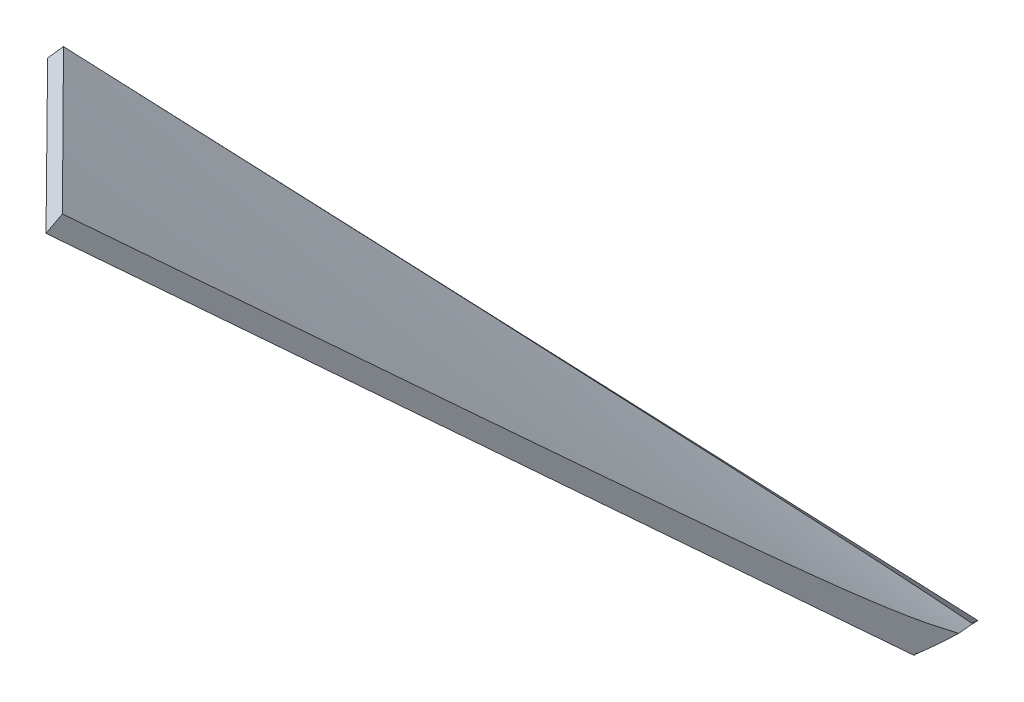
ISO-10303-21;
HEADER;
FILE_DESCRIPTION(('STEP AP214'),'2;1');
FILE_NAME('part.step','',(''),(''),'','','');
FILE_SCHEMA(('AUTOMOTIVE_DESIGN { 1 0 10303 214 1 1 1 1 }'));
ENDSEC;
DATA;
#1=APPLICATION_CONTEXT('core data for automotive mechanical design processes');
#2=APPLICATION_PROTOCOL_DEFINITION('international standard','automotive_design',2000,#1);
#3=PRODUCT_CONTEXT('',#1,'mechanical');
#4=PRODUCT('Part','Part','',(#3));
#5=PRODUCT_RELATED_PRODUCT_CATEGORY('part','',(#4));
#6=PRODUCT_DEFINITION_FORMATION('','',#4);
#7=PRODUCT_DEFINITION_CONTEXT('part definition',#1,'design');
#8=PRODUCT_DEFINITION('design','',#6,#7);
#9=PRODUCT_DEFINITION_SHAPE('','',#8);
#10=(LENGTH_UNIT() NAMED_UNIT(*) SI_UNIT(.MILLI.,.METRE.));
#11=(NAMED_UNIT(*) PLANE_ANGLE_UNIT() SI_UNIT($,.RADIAN.));
#12=(NAMED_UNIT(*) SI_UNIT($,.STERADIAN.) SOLID_ANGLE_UNIT());
#13=UNCERTAINTY_MEASURE_WITH_UNIT(LENGTH_MEASURE(1.E-05),#10,'distance_accuracy_value','');
#14=(GEOMETRIC_REPRESENTATION_CONTEXT(3) GLOBAL_UNCERTAINTY_ASSIGNED_CONTEXT((#13)) GLOBAL_UNIT_ASSIGNED_CONTEXT((#10,
#11,#12)) REPRESENTATION_CONTEXT('',''));
#15=CARTESIAN_POINT('',(0.,0.,0.));
#16=DIRECTION('',(0.,0.,1.));
#17=DIRECTION('',(1.,0.,0.));
#18=AXIS2_PLACEMENT_3D('',#15,#16,#17);
#19=CARTESIAN_POINT('',(125.373540665109,304.904026269313,170.043614927809));
#20=DIRECTION('',(-0.573127406974546,0.259388760360703,-0.777330332852881));
#21=DIRECTION('',(-0.804878930909392,0.,0.593439050432438));
#22=AXIS2_PLACEMENT_3D('',#19,#20,#21);
#23=PLANE('',#22);
#24=CARTESIAN_POINT('',(-299.633713521394,361.646186737307,502.336811715639));
#25=CARTESIAN_POINT('',(-288.248889195906,347.466194704429,489.211010385189));
#26=CARTESIAN_POINT('',(-276.864233903127,333.286011837559,476.085268574526));
#27=CARTESIAN_POINT('',(-254.095497893526,304.924997070927,449.833990752767));
#28=CARTESIAN_POINT('',(-242.711417176659,290.744165171215,436.708454741655));
#29=CARTESIAN_POINT('',(-219.944065032452,262.381582736006,410.457673207292));
#30=CARTESIAN_POINT('',(-208.560793605115,248.199832200505,397.332427684041));
#31=CARTESIAN_POINT('',(-185.795493728506,219.834918850772,371.082381729464));
#32=CARTESIAN_POINT('',(-174.413465279328,205.651756036432,357.957581298172));
#33=CARTESIAN_POINT('',(-157.688399182237,184.806968620088,338.670417652192));
#34=CARTESIAN_POINT('',(-152.344546570563,178.146268476332,332.507762034174));
#35=CARTESIAN_POINT('',(-141.657457027641,164.82417009002,320.182671788908));
#36=CARTESIAN_POINT('',(-136.314220096383,158.162771847475,314.020237161657));
#37=CARTESIAN_POINT('',(-125.628576335731,144.83903650065,301.695666653188));
#38=CARTESIAN_POINT('',(-120.286169506174,138.176699396552,295.53353077191));
#39=CARTESIAN_POINT('',(-109.60250990655,124.850716003804,283.209673035723));
#40=CARTESIAN_POINT('',(-104.261257136551,118.187069715076,277.047951180838));
#41=CARTESIAN_POINT('',(-95.360573497638,107.079388881455,266.77891502101));
#42=CARTESIAN_POINT('',(-91.8006728282525,102.635886778409,262.671432002588));
#43=CARTESIAN_POINT('',(-84.6818718118825,93.7477496316358,254.456825452681));
#44=CARTESIAN_POINT('',(-81.1229714648473,89.303114587967,250.349701921178));
#45=CARTESIAN_POINT('',(-74.006534177173,80.4123017764682,242.135945306376));
#46=CARTESIAN_POINT('',(-70.4489972363188,75.9661240088816,238.029312223));
#47=CARTESIAN_POINT('',(-63.335838701481,67.0715947820844,229.816732902737));
#48=CARTESIAN_POINT('',(-59.780217108774,62.6232433214286,225.710786666308));
#49=CARTESIAN_POINT('',(-54.4489268178406,55.9482932535577,219.552638191287));
#50=CARTESIAN_POINT('',(-52.6721869552184,53.7229059401655,217.50005037959));
#51=CARTESIAN_POINT('',(-49.1196057492542,49.2711160241236,213.395198442784));
#52=CARTESIAN_POINT('',(-47.3437644058719,47.0447134215193,211.34293431766));
#53=CARTESIAN_POINT('',(-43.7932061572879,42.5906349607742,207.238810243283));
#54=CARTESIAN_POINT('',(-42.0184892529597,40.3629591016468,205.186950294345));
#55=CARTESIAN_POINT('',(-38.4705406940791,35.9059311246791,201.083766120683));
#56=CARTESIAN_POINT('',(-36.6973090397554,33.6765790065807,199.032441896043));
#57=CARTESIAN_POINT('',(-34.9249999999667,31.4461867373069,196.981450827258));
#58=B_SPLINE_CURVE_WITH_KNOTS('',3,(#24,#25,#26,#27,#28,#29,#30,#31,#32,#33,#34,#35,#36,#37,#38,
#39,#40,#41,#42,#43,#44,#45,#46,#47,#48,#49,#50,#51,#52,#53,#54,#55,#56,#57),.UNSPECIFIED.,.F.,
.F.,(4,2,2,2,2,2,2,2,2,2,2,2,2,2,2,2,4),(0.,67.2811826532365,134.562360121039,201.843537837132,
269.12472068614,300.717442961109,332.310164719119,363.902880325644,395.49559779708,
416.557439577105,437.619280291128,458.68111768292,479.742969096637,490.273896171492,
500.804822775967,511.33575755134,521.866693948089),.UNSPECIFIED.);
#59=CARTESIAN_POINT('',(-299.633713521394,361.646186737307,502.336811715639));
#60=VERTEX_POINT('',#59);
#61=CARTESIAN_POINT('',(-34.9249999999667,31.4461867373068,196.981450827258));
#62=VERTEX_POINT('',#61);
#63=EDGE_CURVE('E83',#60,#62,#58,.T.);
#64=ORIENTED_EDGE('',*,*,#63,.F.);
#65=CARTESIAN_POINT('',(-292.263898452872,370.241239300258,499.771132815892));
#66=CARTESIAN_POINT('',(-292.571129353185,369.883291165472,499.878189883072));
#67=CARTESIAN_POINT('',(-292.878340832318,369.525320613587,499.985227732709));
#68=CARTESIAN_POINT('',(-293.492724942232,368.809334709742,500.199264999423));
#69=CARTESIAN_POINT('',(-293.799897573014,368.451319357782,500.306264416503));
#70=CARTESIAN_POINT('',(-294.414203993436,367.735243872532,500.520224825237));
#71=CARTESIAN_POINT('',(-294.721337783076,367.377183739242,500.627185816892));
#72=CARTESIAN_POINT('',(-295.335566528425,366.661018710065,500.841069381911));
#73=CARTESIAN_POINT('',(-295.642661484134,366.302913814179,500.947991955275));
#74=CARTESIAN_POINT('',(-296.256812568831,365.586659278535,501.161798690845));
#75=CARTESIAN_POINT('',(-296.56386869782,365.228509638778,501.268682853052));
#76=CARTESIAN_POINT('',(-297.177942136286,364.512165634112,501.48241277344));
#77=CARTESIAN_POINT('',(-297.484959445765,364.153971269202,501.589258531623));
#78=CARTESIAN_POINT('',(-298.098955252422,363.437537832942,501.802911651096));
#79=CARTESIAN_POINT('',(-298.405933749602,363.07929876159,501.909719012388));
#80=CARTESIAN_POINT('',(-299.019851938873,362.362775931146,502.123295345216));
#81=CARTESIAN_POINT('',(-299.326791630965,362.004492172053,502.230064316751));
#82=CARTESIAN_POINT('',(-299.633711924118,361.646186078439,502.336814096976));
#83=B_SPLINE_CURVE_WITH_KNOTS('',3,(#65,#66,#67,#68,#69,#70,#71,#72,#73,#74,#75,#76,#77,#78,#79,
#80,#81,#82),.UNSPECIFIED.,.F.,.F.,(4,2,2,2,2,2,2,2,4),(0.,1.4511409913139,2.90228192808821,
4.35342281813632,5.80456366926453,7.25570448927139,8.70684528594834,10.1579860670793,
11.6091268404411),.UNSPECIFIED.);
#84=CARTESIAN_POINT('',(-292.263898453003,370.241239300415,499.771132816041));
#85=VERTEX_POINT('',#84);
#86=EDGE_CURVE('E102',#85,#60,#83,.T.);
#87=ORIENTED_EDGE('',*,*,#86,.F.);
#88=CARTESIAN_POINT('',(-290.928799495088,368.575782280389,498.231011994713));
#89=CARTESIAN_POINT('',(-290.984427612116,368.645176419685,498.295184242124));
#90=CARTESIAN_POINT('',(-291.040055840348,368.714570536277,498.359356417689));
#91=CARTESIAN_POINT('',(-291.151312547331,368.853358747747,498.487700637713));
#92=CARTESIAN_POINT('',(-291.206941026082,368.922752842625,498.551872682173));
#93=CARTESIAN_POINT('',(-291.318198243902,369.06154101152,498.680216631452));
#94=CARTESIAN_POINT('',(-291.373826982971,369.130935085537,498.744388536271));
#95=CARTESIAN_POINT('',(-291.485084713154,369.269723212617,498.87273221438));
#96=CARTESIAN_POINT('',(-291.540713704269,369.33911726568,498.936903987669));
#97=CARTESIAN_POINT('',(-291.651971948386,369.477905350386,499.065247391856));
#98=CARTESIAN_POINT('',(-291.707601201388,369.547299382029,499.129419022753));
#99=CARTESIAN_POINT('',(-291.81885995996,369.68608742429,499.257762152172));
#100=CARTESIAN_POINT('',(-291.874489465529,369.755481434908,499.321933650693));
#101=CARTESIAN_POINT('',(-291.985748737208,369.894269435565,499.450276507973));
#102=CARTESIAN_POINT('',(-292.041378503318,369.963663425605,499.514447866732));
#103=CARTESIAN_POINT('',(-292.152638291718,370.102451384407,499.642790447588));
#104=CARTESIAN_POINT('',(-292.208268314009,370.171845353169,499.706961669685));
#105=CARTESIAN_POINT('',(-292.263898453161,370.241239299655,499.771132814562));
#106=B_SPLINE_CURVE_WITH_KNOTS('',3,(#88,#89,#90,#91,#92,#93,#94,#95,#96,#97,#98,#99,#100,#101,
#102,#103,#104,#105),.UNSPECIFIED.,.F.,.F.,(4,2,2,2,2,2,2,2,4),(0.,0.329018239303918,
0.658036588457182,0.987055049010126,1.3160736224374,1.64509230376615,1.97411109714723,
2.30313000259779,2.6321490176012),.UNSPECIFIED.);
#107=CARTESIAN_POINT('',(-290.928799498872,368.575782280536,498.231011991137));
#108=VERTEX_POINT('',#107);
#109=EDGE_CURVE('E106',#108,#85,#106,.T.);
#110=ORIENTED_EDGE('',*,*,#109,.F.);
#111=CARTESIAN_POINT('',(-290.928799498872,368.575782280536,498.231011991137));
#112=CARTESIAN_POINT('',(-271.517694071555,344.361557000841,475.839071701633));
#113=CARTESIAN_POINT('',(-252.106594972667,320.147324546612,453.447133684009));
#114=CARTESIAN_POINT('',(-213.284469316911,271.718777388247,408.663283688038));
#115=CARTESIAN_POINT('',(-193.873442760043,247.504462684112,386.27137170969));
#116=CARTESIAN_POINT('',(-162.111410119424,207.882608589925,349.631665499187));
#117=CARTESIAN_POINT('',(-149.760364626518,192.475113875209,335.383857118366));
#118=CARTESIAN_POINT('',(-125.058367808944,161.660017699085,306.88827416668));
#119=CARTESIAN_POINT('',(-112.707416484275,146.252416237677,292.640499595816));
#120=CARTESIAN_POINT('',(-94.181128727366,123.140856201569,271.268887722934));
#121=CARTESIAN_POINT('',(-88.0057226775272,115.436976545684,264.145025426266));
#122=CARTESIAN_POINT('',(-75.6549831826626,100.029134931221,249.897326900889));
#123=CARTESIAN_POINT('',(-69.4796497376366,92.3251729726442,242.773490672179));
#124=CARTESIAN_POINT('',(-57.1290911851592,76.9171262416894,228.525857110339));
#125=CARTESIAN_POINT('',(-50.9538660777077,69.2130414693119,221.402059777209));
#126=CARTESIAN_POINT('',(-38.6036272265079,53.804632334767,207.154541000735));
#127=CARTESIAN_POINT('',(-32.4286134827597,46.1003079725996,200.03081955739));
#128=CARTESIAN_POINT('',(-26.2537569346537,38.3958054284483,192.90715455688));
#129=B_SPLINE_CURVE_WITH_KNOTS('',3,(#111,#112,#113,#114,#115,#116,#117,#118,#119,#120,#121,
#122,#123,#124,#125,#126,#127,#128),.UNSPECIFIED.,.F.,.F.,(4,2,2,2,2,2,2,2,4),(0.,
114.807092062028,229.614184158254,302.665216705724,375.716249242009,412.241765540331,
448.76728183583,485.29279814286,521.81831445995),.UNSPECIFIED.);
#130=CARTESIAN_POINT('',(-26.2537569346536,38.3958054284492,192.907154560123));
#131=VERTEX_POINT('',#130);
#132=EDGE_CURVE('E381',#108,#131,#129,.T.);
#133=ORIENTED_EDGE('',*,*,#132,.T.);
#134=CARTESIAN_POINT('',(-33.4260017540192,32.6478763110671,196.277230001507));
#135=CARTESIAN_POINT('',(-32.2307127935156,33.6060423735449,195.715672917081));
#136=CARTESIAN_POINT('',(-31.0353812509547,34.5641194931145,195.154054757288));
#137=CARTESIAN_POINT('',(-28.6446329775563,36.4800958658009,194.030696275617));
#138=CARTESIAN_POINT('',(-27.4492162467172,37.437995118914,193.468955953737));
#139=CARTESIAN_POINT('',(-26.2537569338189,38.3958054291152,192.907154556487));
#140=B_SPLINE_CURVE_WITH_KNOTS('',3,(#134,#135,#136,#137,#138,#139),.UNSPECIFIED.,.F.,.F.,(4,2,
4),(0.,4.89482359128834,9.78964728151495),.UNSPECIFIED.);
#141=CARTESIAN_POINT('',(-33.4260017540192,32.6478763110671,196.277230001507));
#142=VERTEX_POINT('',#141);
#143=EDGE_CURVE('E278',#142,#131,#140,.T.);
#144=ORIENTED_EDGE('',*,*,#143,.F.);
#145=CARTESIAN_POINT('',(-35.01202047802,31.3770766222561,197.02254974302));
#146=CARTESIAN_POINT('',(-34.7470017104372,31.5874509548251,196.897350998529));
#147=CARTESIAN_POINT('',(-34.4823240996457,31.7985380951771,196.772641647825));
#148=CARTESIAN_POINT('',(-33.9536511916456,32.2221379914473,196.524201733987));
#149=CARTESIAN_POINT('',(-33.6896558944369,32.4346507473655,196.400471170854));
#150=CARTESIAN_POINT('',(-33.4260017540197,32.6478763110667,196.277230001507));
#151=B_SPLINE_CURVE_WITH_KNOTS('',3,(#145,#146,#147,#148,#149,#150),.UNSPECIFIED.,.F.,.F.,(4,2,
4),(0.,1.08234928080774,2.16469856161548),.UNSPECIFIED.);
#152=EDGE_CURVE('E245',#62,#142,#151,.T.);
#153=ORIENTED_EDGE('',*,*,#152,.F.);
#154=EDGE_LOOP('',(#64,#87,#110,#133,#144,#153));
#155=FACE_BOUND('',#154,.T.);
#156=ADVANCED_FACE('F38',(#155),#23,.T.);
#157=CARTESIAN_POINT('',(48.6776760325675,362.607329490371,21.4180803513587));
#158=DIRECTION('',(0.915166256682117,0.0180699960875279,0.402671327352517));
#159=DIRECTION('',(0.402737084535447,0.,-0.91531570550269));
#160=AXIS2_PLACEMENT_3D('',#157,#158,#159);
#161=PLANE('',#160);
#162=CARTESIAN_POINT('',(-25.8643819167033,37.8799147545019,205.404856215703));
#163=CARTESIAN_POINT('',(-26.2965330034078,38.4885291076643,206.35971047833));
#164=CARTESIAN_POINT('',(-26.7270469135784,39.104626881281,207.3105080476));
#165=CARTESIAN_POINT('',(-27.5850011057089,40.3504060767736,209.204508065537));
#166=CARTESIAN_POINT('',(-28.0124414998223,40.9800869996082,210.147710791494));
#167=CARTESIAN_POINT('',(-28.8639876643985,42.2509577981747,212.026021051234));
#168=CARTESIAN_POINT('',(-29.2880967234923,42.8921335003953,212.961136695253));
#169=CARTESIAN_POINT('',(-30.1336977521508,44.1854898042586,214.824926177428));
#170=CARTESIAN_POINT('',(-30.5551896950501,44.8376705177784,215.753599949961));
#171=CARTESIAN_POINT('',(-31.8155548898086,46.808221566628,218.529650221397));
#172=CARTESIAN_POINT('',(-32.6508287785659,48.1413674085533,220.368183257256));
#173=CARTESIAN_POINT('',(-34.3131055126675,50.838974083578,224.025046148229));
#174=CARTESIAN_POINT('',(-35.1401103179812,52.2034272307384,225.843380802748));
#175=CARTESIAN_POINT('',(-36.787373665056,54.9577253011071,229.463578161574));
#176=CARTESIAN_POINT('',(-37.6076326101415,56.3475686900306,231.265441851383));
#177=CARTESIAN_POINT('',(-39.2426276785469,59.1478380461247,234.8556936571));
#178=CARTESIAN_POINT('',(-40.0573636497886,60.5582645767193,236.644081402089));
#179=CARTESIAN_POINT('',(-41.6814179826039,63.3943103737166,240.207862308444));
#180=CARTESIAN_POINT('',(-42.4907410339778,64.8199126207872,241.983266892241));
#181=CARTESIAN_POINT('',(-44.105712407069,67.6848491173878,245.52510813595));
#182=CARTESIAN_POINT('',(-44.9113601830128,69.1241853141862,247.291543468077));
#183=CARTESIAN_POINT('',(-46.5196099944758,72.0141223214242,250.816986460717));
#184=CARTESIAN_POINT('',(-47.3222116272715,73.4647245490425,252.57599314235));
#185=CARTESIAN_POINT('',(-48.9248638326029,76.3751917844716,256.087792945075));
#186=CARTESIAN_POINT('',(-49.7249141657122,77.8350576252963,257.840585484632));
#187=CARTESIAN_POINT('',(-51.3228523739221,80.7624188327542,261.340913486921));
#188=CARTESIAN_POINT('',(-52.1207401572946,82.2299145155471,263.088448726993));
#189=CARTESIAN_POINT('',(-53.7146573583217,85.1711956975998,266.579013372145));
#190=CARTESIAN_POINT('',(-54.5106868047267,86.6449810985402,268.32204284698));
#191=CARTESIAN_POINT('',(-56.25632821841,89.8858706529682,272.143991796312));
#192=CARTESIAN_POINT('',(-57.2056067211694,91.6541078828564,274.222102546325));
#193=CARTESIAN_POINT('',(-59.1022614422828,95.1966119696952,278.373730071786));
#194=CARTESIAN_POINT('',(-60.0496378041691,96.9708783422341,280.447247195183));
#195=CARTESIAN_POINT('',(-61.9428303391441,100.524404118135,284.590511478522));
#196=CARTESIAN_POINT('',(-62.8886465871367,102.30366327001,286.660258819985));
#197=CARTESIAN_POINT('',(-64.7789957329516,105.866355440619,290.796649481234));
#198=CARTESIAN_POINT('',(-65.7235286603709,107.649788360421,292.863292872726));
#199=CARTESIAN_POINT('',(-67.6115371360341,111.22017935924,296.994018317751));
#200=CARTESIAN_POINT('',(-68.555012683519,113.007137440785,299.058100369447));
#201=CARTESIAN_POINT('',(-70.4413375242919,116.584525959615,303.184685338391));
#202=CARTESIAN_POINT('',(-71.3841865646098,118.374957236838,305.247187643013));
#203=CARTESIAN_POINT('',(-73.2691440034793,121.958368738736,309.370394583105));
#204=CARTESIAN_POINT('',(-74.2112523871742,123.751349012611,311.431099182602));
#205=CARTESIAN_POINT('',(-76.0948337789633,127.339477569891,315.550967049518));
#206=CARTESIAN_POINT('',(-77.0363067780074,129.134625883202,317.610130295027));
#207=CARTESIAN_POINT('',(-78.9187034675635,132.726772947788,321.727125312945));
#208=CARTESIAN_POINT('',(-79.8596271536788,134.523771713564,323.784957074712));
#209=CARTESIAN_POINT('',(-81.7409942698826,138.119358185298,327.899457798162));
#210=CARTESIAN_POINT('',(-82.6814376992262,139.91794589371,329.956126758042));
#211=CARTESIAN_POINT('',(-86.0950285678902,146.450310185385,337.421181197578));
#212=CARTESIAN_POINT('',(-88.5669504054922,151.188117232352,342.826600337891));
#213=CARTESIAN_POINT('',(-93.5087660549621,160.670269041806,353.63253606629));
#214=CARTESIAN_POINT('',(-95.9786598838697,165.414613748446,359.033052695608));
#215=CARTESIAN_POINT('',(-100.916980001921,174.908050963357,369.830537562461));
#216=CARTESIAN_POINT('',(-103.385406297159,179.657143451693,375.22750581474));
#217=CARTESIAN_POINT('',(-108.321176907092,189.158856031299,386.018824959229));
#218=CARTESIAN_POINT('',(-110.78852122237,193.911476120668,391.413175852848));
#219=CARTESIAN_POINT('',(-115.722077077461,203.418786689675,402.199210229338));
#220=CARTESIAN_POINT('',(-118.188288721341,208.17347682972,407.590893963964));
#221=CARTESIAN_POINT('',(-123.120084078611,217.684929334352,418.372741320305));
#222=CARTESIAN_POINT('',(-125.585667790772,222.441691702951,423.762904939044));
#223=CARTESIAN_POINT('',(-130.51634105581,231.956840545669,434.542036199928));
#224=CARTESIAN_POINT('',(-132.981430608144,236.715227021555,439.93100384076));
#225=CARTESIAN_POINT('',(-137.911214267097,246.233290147238,450.707982481147));
#226=CARTESIAN_POINT('',(-140.375908373643,250.992966797272,456.095993480527));
#227=CARTESIAN_POINT('',(-145.304992991091,260.513391518738,466.871277405703));
#228=CARTESIAN_POINT('',(-147.769383499914,265.274139596937,472.258550326471));
#229=CARTESIAN_POINT('',(-152.697902045965,274.796482770925,483.032461628782));
#230=CARTESIAN_POINT('',(-155.162030083339,279.558077866241,488.419100010678));
#231=CARTESIAN_POINT('',(-160.090069697005,289.081967624749,499.191853421918));
#232=CARTESIAN_POINT('',(-162.553981273375,293.844262287687,504.577968451452));
#233=CARTESIAN_POINT('',(-167.481624290135,303.369435238096,515.349762918382));
#234=CARTESIAN_POINT('',(-169.945355730557,308.132313525462,520.735442355855));
#235=CARTESIAN_POINT('',(-174.872988550427,317.659182155336,531.507137553807));
#236=CARTESIAN_POINT('',(-177.336889910184,322.423172561879,536.893153266659));
#237=CARTESIAN_POINT('',(-182.264564915093,331.951570908876,547.664875693622));
#238=CARTESIAN_POINT('',(-184.728338560222,336.715978849405,553.050582407678));
#239=CARTESIAN_POINT('',(-189.655777430499,346.245151684005,563.821733407226));
#240=CARTESIAN_POINT('',(-192.119442655608,351.0099165782,569.207177692627));
#241=CARTESIAN_POINT('',(-197.046679897087,360.539756017879,579.977840528727));
#242=CARTESIAN_POINT('',(-199.510251913407,365.304830563524,585.363059079308));
#243=CARTESIAN_POINT('',(-201.973784077308,370.070034632494,590.7481812434));
#244=B_SPLINE_CURVE_WITH_KNOTS('',3,(#162,#163,#164,#165,#166,#167,#168,#169,#170,#171,#172,
#173,#174,#175,#176,#177,#178,#179,#180,#181,#182,#183,#184,#185,#186,#187,#188,#189,#190,#191,
#192,#193,#194,#195,#196,#197,#198,#199,#200,#201,#202,#203,#204,#205,#206,#207,#208,#209,#210,
#211,#212,#213,#214,#215,#216,#217,#218,#219,#220,#221,#222,#223,#224,#225,#226,#227,#228,#229,
#230,#231,#232,#233,#234,#235,#236,#237,#238,#239,#240,#241,#242,#243),.UNSPECIFIED.,.F.,.F.,(4,
2,2,2,2,2,2,2,2,2,2,2,2,2,2,2,2,2,2,2,2,2,2,2,2,2,2,2,2,2,2,2,2,2,2,2,2,2,2,2,4),(0.,
3.63589817961035,7.27166300401618,10.9032171180098,14.5348081726657,21.7936224964146,
29.0506734562355,36.3072873271673,43.5641002079314,50.8134889231137,58.063921235373,
65.3152808645544,72.5673020704696,79.8196262138649,87.0718374027661,95.7388322050663,
104.405146387563,113.071031611809,121.736713463758,130.40240153141,139.070543318612,
147.738854753588,156.40728715547,165.075788015105,173.744302278986,196.547406433229,
219.350316991643,242.153132202748,264.95593513122,287.755842110555,310.555793425048,
333.35576963441,356.155750027319,378.955878689101,401.755994656698,424.556102340985,
447.35620596664,470.15928069067,492.962359494544,515.765446312218,538.568545038479),.UNSPECIFIED.);
#245=CARTESIAN_POINT('',(-25.8641979114218,37.8797293807954,205.404446339571));
#246=VERTEX_POINT('',#245);
#247=CARTESIAN_POINT('',(-201.921191103714,369.968304155451,590.633216401593));
#248=VERTEX_POINT('',#247);
#249=EDGE_CURVE('E379',#246,#248,#244,.T.);
#250=ORIENTED_EDGE('',*,*,#249,.T.);
#251=CARTESIAN_POINT('',(-201.973784076033,370.070034632196,590.748181244195));
#252=CARTESIAN_POINT('',(-201.971592716235,370.065795863621,590.743391032623));
#253=CARTESIAN_POINT('',(-201.969401353905,370.061557094606,590.738600822598));
#254=CARTESIAN_POINT('',(-201.965018625083,370.053079556376,590.729020405857));
#255=CARTESIAN_POINT('',(-201.962827258591,370.048840787161,590.724230199141));
#256=CARTESIAN_POINT('',(-201.958444521712,370.040363247991,590.714649787854));
#257=CARTESIAN_POINT('',(-201.956253151325,370.036124478035,590.709859583282));
#258=CARTESIAN_POINT('',(-201.951870409431,370.027646938356,590.700279175088));
#259=CARTESIAN_POINT('',(-201.949679037924,370.023408168633,590.695488971466));
#260=CARTESIAN_POINT('',(-201.945296291331,370.014930629163,590.685908567231));
#261=CARTESIAN_POINT('',(-201.943104916246,370.010691859416,590.681118366619));
#262=CARTESIAN_POINT('',(-201.938722162604,370.002214319722,590.671537968001));
#263=CARTESIAN_POINT('',(-201.936530784049,369.997975549774,590.666747769996));
#264=CARTESIAN_POINT('',(-201.932148023391,369.989498009189,590.657167375864));
#265=CARTESIAN_POINT('',(-201.929956641289,369.985259238551,590.652377179736));
#266=CARTESIAN_POINT('',(-201.925573874707,369.976781697385,590.642796789496));
#267=CARTESIAN_POINT('',(-201.923382490228,369.972542926857,590.638006595383));
#268=CARTESIAN_POINT('',(-201.92119110487,369.968304156249,590.633216401743));
#269=B_SPLINE_CURVE_WITH_KNOTS('',3,(#251,#252,#253,#254,#255,#256,#257,#258,#259,#260,#261,
#262,#263,#264,#265,#266,#267,#268),.UNSPECIFIED.,.F.,.F.,(4,2,2,2,2,2,2,2,4),(0.,
0.020283936830788,0.040567871050979,0.0608518058949544,0.081135739372587,0.101419669976432,
0.12170359879045,0.1419875283604,0.162271455753208),.UNSPECIFIED.);
#270=CARTESIAN_POINT('',(-201.973784077307,370.070034632494,590.7481812434));
#271=VERTEX_POINT('',#270);
#272=EDGE_CURVE('E123',#248,#271,#269,.F.);
#273=ORIENTED_EDGE('',*,*,#272,.T.);
#274=CARTESIAN_POINT('',(-204.997061327172,361.646186739858,597.997319743836));
#275=CARTESIAN_POINT('',(-204.87094611933,361.997004424452,597.695128539124));
#276=CARTESIAN_POINT('',(-204.744849084526,362.347844128601,597.392955312945));
#277=CARTESIAN_POINT('',(-204.492691355183,363.049567559264,596.7886448119));
#278=CARTESIAN_POINT('',(-204.366630660643,363.400451285779,596.486507537035));
#279=CARTESIAN_POINT('',(-204.11454560602,364.102262744428,595.882268932872));
#280=CARTESIAN_POINT('',(-203.988521245936,364.453190476562,595.580167603574));
#281=CARTESIAN_POINT('',(-203.736508854411,365.155089929712,594.976000884796));
#282=CARTESIAN_POINT('',(-203.610520822972,365.506061650728,594.673935495316));
#283=CARTESIAN_POINT('',(-203.358581082926,366.208049064907,594.069840650427));
#284=CARTESIAN_POINT('',(-203.23262937432,366.559064758072,593.767811195019));
#285=CARTESIAN_POINT('',(-202.980762274132,367.261140099821,593.163788212522));
#286=CARTESIAN_POINT('',(-202.85484688255,367.612199748406,592.861794685435));
#287=CARTESIAN_POINT('',(-202.603052410597,368.314362984277,592.257843553833));
#288=CARTESIAN_POINT('',(-202.477173330228,368.665466571563,591.95588594932));
#289=CARTESIAN_POINT('',(-202.225451474889,369.36771766812,591.352006657116));
#290=CARTESIAN_POINT('',(-202.099608699921,369.718865177392,591.050084969426));
#291=CARTESIAN_POINT('',(-201.97378407724,370.070034632344,590.748181243254));
#292=B_SPLINE_CURVE_WITH_KNOTS('',3,(#274,#275,#276,#277,#278,#279,#280,#281,#282,#283,#284,
#285,#286,#287,#288,#289,#290,#291),.UNSPECIFIED.,.F.,.F.,(4,2,2,2,2,2,2,2,4),(0.,
1.4396800185012,2.87936004415944,4.31904008412378,5.75872014553524,7.19840023552639,
8.63808036122151,10.0777605297367,11.5174407481804),.UNSPECIFIED.);
#293=CARTESIAN_POINT('',(-204.997061337424,361.646186737307,597.997319736598));
#294=VERTEX_POINT('',#293);
#295=EDGE_CURVE('E95',#271,#294,#292,.F.);
#296=ORIENTED_EDGE('',*,*,#295,.T.);
#297=DIRECTION('',(0.324104895833965,-0.62691541117386,-0.708472359185004));
#298=VECTOR('',#297,1.);
#299=CARTESIAN_POINT('',(-46.1515914517281,54.3917319664172,250.771386920495));
#300=LINE('',#299,#298);
#301=CARTESIAN_POINT('',(-34.2891241813679,31.4461867373069,224.84079999998));
#302=VERTEX_POINT('',#301);
#303=EDGE_CURVE('E382',#294,#302,#300,.T.);
#304=ORIENTED_EDGE('',*,*,#303,.T.);
#305=DIRECTION('',(0.266763291800928,0.721758487280027,-0.638672085022338));
#306=VECTOR('',#305,1.);
#307=CARTESIAN_POINT('',(-34.33437479214,31.3237560529392,224.949136876974));
#308=LINE('',#307,#306);
#309=CARTESIAN_POINT('',(-33.8861940552726,32.5362896003207,223.876126897563));
#310=VERTEX_POINT('',#309);
#311=EDGE_CURVE('E249',#310,#302,#308,.F.);
#312=ORIENTED_EDGE('',*,*,#311,.F.);
#313=CARTESIAN_POINT('',(-33.2558859656816,30.9171201408934,222.516262703179));
#314=CARTESIAN_POINT('',(-33.3529531400182,31.1680144958528,222.725611958628));
#315=CARTESIAN_POINT('',(-33.4501614262258,31.4185738760477,222.935296956421));
#316=CARTESIAN_POINT('',(-33.644853330382,31.9190356354269,223.355322191918));
#317=CARTESIAN_POINT('',(-33.742336948344,32.1689380145794,223.565662429653));
#318=CARTESIAN_POINT('',(-34.0156267537734,32.8676603748001,224.155423065133));
#319=CARTESIAN_POINT('',(-34.1917333846187,33.3157594663579,224.535558641963));
#320=CARTESIAN_POINT('',(-34.36825457695,33.7628533266945,224.916681518312));
#321=B_SPLINE_CURVE_WITH_KNOTS('',3,(#313,#314,#315,#316,#317,#318,#319,#320),.UNSPECIFIED.,.F.,
.F.,(4,2,2,4),(0.,1.02263031321406,2.04526067597971,3.88557496084136),.UNSPECIFIED.);
#322=CARTESIAN_POINT('',(-33.7107945039055,32.0879297490942,223.497637745172));
#323=VERTEX_POINT('',#322);
#324=EDGE_CURVE('E244',#323,#310,#321,.T.);
#325=ORIENTED_EDGE('',*,*,#324,.F.);
#326=CARTESIAN_POINT('',(-25.8639221740813,37.8796284871992,205.403824188104));
#327=CARTESIAN_POINT('',(-26.54789815499,37.2499284833835,206.986580076885));
#328=CARTESIAN_POINT('',(-27.2365797462856,36.6487853937523,208.57874908331));
#329=CARTESIAN_POINT('',(-28.6219456591585,35.5070033813506,211.778560059562));
#330=CARTESIAN_POINT('',(-29.318618869796,34.9662895768166,213.386180137479));
#331=CARTESIAN_POINT('',(-30.7237515230632,33.9446382933494,216.625524825149));
#332=CARTESIAN_POINT('',(-31.4322522777685,33.4640104957504,218.257329429366));
#333=CARTESIAN_POINT('',(-32.8578382840548,32.5676415913905,221.537537136793));
#334=CARTESIAN_POINT('',(-33.574933233787,32.1519830681102,223.185958575397));
#335=CARTESIAN_POINT('',(-34.2955258306848,31.7704022719176,224.84079999998));
#336=B_SPLINE_CURVE_WITH_KNOTS('',3,(#326,#327,#328,#329,#330,#331,#332,#333,#334,#335),
.UNSPECIFIED.,.F.,.F.,(4,2,2,2,4),(0.,5.50668207721765,11.0064629897918,16.5335133876659,
22.0675331542072),.UNSPECIFIED.);
#337=EDGE_CURVE('E241',#246,#323,#336,.T.);
#338=ORIENTED_EDGE('',*,*,#337,.F.);
#339=EDGE_LOOP('',(#250,#273,#296,#304,#312,#325,#338));
#340=FACE_BOUND('',#339,.T.);
#341=ADVANCED_FACE('F40',(#340),#161,.T.);
#342=CARTESIAN_POINT('',(-26.9939307547615,39.7683041554507,217.476696664976));
#343=CARTESIAN_POINT('',(-26.4877957951712,38.9389280460651,216.539425003767));
#344=CARTESIAN_POINT('',(-25.979334962238,38.1102230661662,215.60291178091));
#345=CARTESIAN_POINT('',(-25.4683574331419,37.2822442775747,214.66721922135));
#346=CARTESIAN_POINT('',(-25.4632476578509,37.2739644896888,214.657862295755));
#347=CARTESIAN_POINT('',(-25.45813788256,37.2656847018029,214.648505370159));
#348=CARTESIAN_POINT('',(-25.453028107269,37.2574049139169,214.639148444563));
#349=B_SPLINE_CURVE_WITH_KNOTS('',3,(#342,#343,#344,#345,#346,#347,#348),.UNSPECIFIED.,.F.,.F.,
(4,3,4),(0.,1.,1.01),.UNSPECIFIED.);
#350=DIRECTION('',(0.610722946119665,0.497356328708973,-0.616160827524802));
#351=VECTOR('',#350,1.);
#352=SURFACE_OF_LINEAR_EXTRUSION('',#349,#351);
#353=CARTESIAN_POINT('',(-33.710787002775,32.0879369899787,223.49764811685));
#354=CARTESIAN_POINT('',(-33.7613790557658,32.0605188083739,223.553376712854));
#355=CARTESIAN_POINT('',(-33.8119765102865,32.0331821611837,223.60914052121));
#356=CARTESIAN_POINT('',(-33.9131702338414,31.9786787757327,223.72072554415));
#357=CARTESIAN_POINT('',(-33.9637665004311,31.9515119995521,223.776546742429));
#358=CARTESIAN_POINT('',(-34.0649577023103,31.8973487000556,223.888246544712));
#359=CARTESIAN_POINT('',(-34.1155526352397,31.8703521390932,223.9441251326));
#360=CARTESIAN_POINT('',(-34.2167410214821,31.8165296145977,224.055939713186));
#361=CARTESIAN_POINT('',(-34.2673344725193,31.7897036136958,224.111875689957));
#362=CARTESIAN_POINT('',(-34.3685197451365,31.7362225544745,224.223805047504));
#363=CARTESIAN_POINT('',(-34.4191115645241,31.7095674590686,224.279798412541));
#364=CARTESIAN_POINT('',(-34.5202934221443,31.6564285565902,224.391842545743));
#365=CARTESIAN_POINT('',(-34.5708834582675,31.6299447127178,224.44789329836));
#366=CARTESIAN_POINT('',(-34.67206159613,31.5771486596521,224.56005220596));
#367=CARTESIAN_POINT('',(-34.7226496958425,31.55083641395,224.616160345584));
#368=CARTESIAN_POINT('',(-34.8238238051239,31.4983839041605,224.728434026005));
#369=CARTESIAN_POINT('',(-34.874409812748,31.47224360386,224.784599551635));
#370=CARTESIAN_POINT('',(-34.9250001475427,31.4461866612967,224.840799831894));
#371=B_SPLINE_CURVE_WITH_KNOTS('',3,(#353,#354,#355,#356,#357,#358,#359,#360,#361,#362,#363,
#364,#365,#366,#367,#368,#369,#370),.UNSPECIFIED.,.F.,.F.,(4,2,2,2,2,2,2,2,4),(0.,
0.240318283275,0.480580855108785,0.720788280300995,0.960941126725353,1.20103996535267,
1.44108537027425,1.68107791872532,1.92101819110852),.UNSPECIFIED.);
#372=CARTESIAN_POINT('',(-34.9249999999667,31.4461867373069,224.84079999998));
#373=VERTEX_POINT('',#372);
#374=EDGE_CURVE('E72',#323,#373,#371,.T.);
#375=ORIENTED_EDGE('',*,*,#374,.F.);
#376=ORIENTED_EDGE('',*,*,#324,.T.);
#377=CARTESIAN_POINT('',(-33.8862615174222,32.5362962765711,223.876061786248));
#378=CARTESIAN_POINT('',(-33.929543534118,32.4908747333891,223.916258735904));
#379=CARTESIAN_POINT('',(-33.9728254438261,32.4454531796282,223.956455788806));
#380=CARTESIAN_POINT('',(-34.0593889401029,32.3546101653478,224.036849999981));
#381=CARTESIAN_POINT('',(-34.1026705266721,32.3091887048284,224.077047158254));
#382=CARTESIAN_POINT('',(-34.1892333764618,32.2183458770916,224.15744158024));
#383=CARTESIAN_POINT('',(-34.2325146396827,32.1729245098742,224.197638843953));
#384=CARTESIAN_POINT('',(-34.3190768425663,32.0820818688018,224.278033476888));
#385=CARTESIAN_POINT('',(-34.3623577822294,32.0366605949468,224.318230846109));
#386=CARTESIAN_POINT('',(-34.4489193377881,31.9458181406596,224.398625690128));
#387=CARTESIAN_POINT('',(-34.4921999536841,31.9003969602275,224.438823164926));
#388=CARTESIAN_POINT('',(-34.5787608614988,31.8095546928464,224.519218220166));
#389=CARTESIAN_POINT('',(-34.6220411534182,31.7641336058976,224.559415800608));
#390=CARTESIAN_POINT('',(-34.7086014130702,31.6732915255435,224.639811067207));
#391=CARTESIAN_POINT('',(-34.7518813808034,31.6278705321384,224.680008753362));
#392=CARTESIAN_POINT('',(-34.8384409918738,31.5370286389322,224.760404231455));
#393=CARTESIAN_POINT('',(-34.8817206352115,31.4916077391313,224.800602023391));
#394=CARTESIAN_POINT('',(-34.9250001710007,31.4461868286991,224.840799919109));
#395=B_SPLINE_CURVE_WITH_KNOTS('',3,(#377,#378,#379,#380,#381,#382,#383,#384,#385,#386,#387,
#388,#389,#390,#391,#392,#393,#394),.UNSPECIFIED.,.F.,.F.,(4,2,2,2,2,2,2,2,4),(0.,
0.223540150406504,0.447079737736746,0.670618761629434,0.894157221723073,1.11769511765635,
1.34123244906798,1.56476921559648,1.78830541688056),.UNSPECIFIED.);
#396=EDGE_CURVE('E276',#310,#373,#395,.T.);
#397=ORIENTED_EDGE('',*,*,#396,.T.);
#398=EDGE_LOOP('',(#375,#376,#397));
#399=FACE_BOUND('',#398,.T.);
#400=ADVANCED_FACE('F201',(#399),#352,.T.);
#401=CARTESIAN_POINT('',(-34.9249999999667,31.4461867373069,98.8702406093947));
#402=CARTESIAN_POINT('',(-34.9249999999667,31.4461867373069,131.339237073432));
#403=CARTESIAN_POINT('',(-34.9249999999667,31.4461867373069,163.80823353747));
#404=CARTESIAN_POINT('',(-34.9249999999667,31.4461867373069,196.277230001507));
#405=CARTESIAN_POINT('',(-26.2294319363748,38.3653450894073,98.8702406093947));
#406=CARTESIAN_POINT('',(-26.2378358905899,38.3759066566041,131.339237073432));
#407=CARTESIAN_POINT('',(-26.2462347198661,38.3864222904978,163.808233537469));
#408=CARTESIAN_POINT('',(-26.254628137468,38.3968923141524,196.277230001507));
#409=B_SPLINE_SURFACE_WITH_KNOTS('',1,3,((#401,#402,#403,#404),(#405,#406,#407,#408)),
.UNSPECIFIED.,.F.,.F.,.F.,(2,2),(4,4),(0.,1.),(-0.0487034946960559,0.0487034946960561),.UNSPECIFIED.);
#410=CARTESIAN_POINT('',(-26.254628137468,38.3968923141524,196.277230001507));
#411=CARTESIAN_POINT('',(-34.9249999999667,31.4461867373069,196.277230001507));
#412=B_SPLINE_CURVE_WITH_KNOTS('',1,(#410,#411),.UNSPECIFIED.,.F.,.F.,(2,2),(0.,1.),.UNSPECIFIED.);
#413=CARTESIAN_POINT('',(-26.254628137468,38.3968923141524,196.277230001507));
#414=VERTEX_POINT('',#413);
#415=EDGE_CURVE('E109',#414,#142,#412,.T.);
#416=CARTESIAN_POINT('',(-26.2294319363748,38.3653450894073,98.8702406093947));
#417=CARTESIAN_POINT('',(-26.2378358905899,38.3759066566041,131.339237073432));
#418=CARTESIAN_POINT('',(-26.2462347198661,38.3864222904978,163.808233537469));
#419=CARTESIAN_POINT('',(-26.254628137468,38.3968923141524,196.277230001507));
#420=B_SPLINE_CURVE_WITH_KNOTS('',3,(#416,#417,#418,#419),.UNSPECIFIED.,.F.,.F.,(4,4),
(-0.0487034946960559,0.0487034946960561),.UNSPECIFIED.);
#421=EDGE_CURVE('E50',#131,#414,#420,.T.);
#422=ORIENTED_EDGE('',*,*,#415,.T.);
#423=ORIENTED_EDGE('',*,*,#143,.T.);
#424=ORIENTED_EDGE('',*,*,#421,.T.);
#425=EDGE_LOOP('',(#422,#423,#424));
#426=FACE_BOUND('',#425,.T.);
#427=ADVANCED_FACE('F149',(#426),#409,.T.);
#428=CARTESIAN_POINT('',(-204.102267840138,361.562009286028,599.004945854514));
#429=CARTESIAN_POINT('',(-204.417718177378,361.562003021692,598.686072379738));
#430=CARTESIAN_POINT('',(-204.733168514617,361.561996757356,598.367198904963));
#431=CARTESIAN_POINT('',(-205.048618851856,361.56199049302,598.048325430187));
#432=CARTESIAN_POINT('',(-236.593652575774,361.561364059424,566.160977952631));
#433=CARTESIAN_POINT('',(-268.138696095898,361.560765874498,534.273640166434));
#434=CARTESIAN_POINT('',(-299.683749490817,361.560193281437,502.386312149339));
#435=CARTESIAN_POINT('',(-204.050694815584,361.646186737307,598.953924816807));
#436=CARTESIAN_POINT('',(-204.366150322864,361.646186737307,598.635056456737));
#437=CARTESIAN_POINT('',(-204.681605830144,361.646186737307,598.316188096668));
#438=CARTESIAN_POINT('',(-204.997061337424,361.646186737307,597.997319736598));
#439=CARTESIAN_POINT('',(-236.542612065414,361.646186737307,566.110483729612));
#440=CARTESIAN_POINT('',(-268.088162793404,361.646186737307,534.223647722625));
#441=CARTESIAN_POINT('',(-299.633713521394,361.646186737307,502.336811715639));
#442=CARTESIAN_POINT('',(-198.893392360182,370.063931865218,593.851821046121));
#443=CARTESIAN_POINT('',(-199.209364871534,370.064558298814,593.533464156621));
#444=CARTESIAN_POINT('',(-199.525337382886,370.065184732411,593.215107267121));
#445=CARTESIAN_POINT('',(-199.841309894238,370.065811166007,592.896750377622));
#446=CARTESIAN_POINT('',(-231.43856102946,370.128454525639,561.06106142766));
#447=CARTESIAN_POINT('',(-263.034832544071,370.188273018238,529.224403341747));
#448=CARTESIAN_POINT('',(-294.63011657913,370.245532324333,497.386768345703));
#449=B_SPLINE_SURFACE_WITH_KNOTS('',1,3,((#428,#429,#430,#431,#432,#433,#434),(#435,#436,#437,
#438,#439,#440,#441),(#442,#443,#444,#445,#446,#447,#448)),.UNSPECIFIED.,.F.,.F.,.F.,(2,1,2),(4,
3,4),(-0.01,0.,1.),(-0.0686268036050178,-0.0672811800049194,0.0672811800049197),.UNSPECIFIED.);
#450=CARTESIAN_POINT('',(-201.973784077193,370.070034632356,590.748181243287));
#451=CARTESIAN_POINT('',(-205.735983523166,370.077478301234,586.957581169625));
#452=CARTESIAN_POINT('',(-209.498169140014,370.084882006654,583.166967291995));
#453=CARTESIAN_POINT('',(-217.022512565879,370.099610387277,575.585712026528));
#454=CARTESIAN_POINT('',(-220.784670374897,370.106935062485,571.795070638691));
#455=CARTESIAN_POINT('',(-228.308958158564,370.121506279636,564.21376032657));
#456=CARTESIAN_POINT('',(-232.071088133213,370.128752821582,560.423091402286));
#457=CARTESIAN_POINT('',(-239.595320221612,370.143168669164,552.841725991023));
#458=CARTESIAN_POINT('',(-243.357422335363,370.150337974802,549.051029504044));
#459=CARTESIAN_POINT('',(-250.881598675431,370.164600246719,541.469608941145));
#460=CARTESIAN_POINT('',(-254.64367290175,370.171693212999,537.678884865227));
#461=CARTESIAN_POINT('',(-262.167793440424,370.185803703154,530.097409098201));
#462=CARTESIAN_POINT('',(-265.929839752779,370.19282122703,526.306657407095));
#463=CARTESIAN_POINT('',(-273.453904436993,370.206781729326,518.725126383451));
#464=CARTESIAN_POINT('',(-277.215922808851,370.213724707748,514.934347050913));
#465=CARTESIAN_POINT('',(-284.739931585544,370.22753701609,507.352760718155));
#466=CARTESIAN_POINT('',(-288.501921990379,370.234406346011,503.561953717934));
#467=CARTESIAN_POINT('',(-292.263898452864,370.241239300255,499.771132815903));
#468=B_SPLINE_CURVE_WITH_KNOTS('',3,(#450,#451,#452,#453,#454,#455,#456,#457,#458,#459,#460,
#461,#462,#463,#464,#465,#466,#467),.UNSPECIFIED.,.F.,.F.,(4,2,2,2,2,2,2,2,4),(0.,
16.0220361057746,32.0440716953855,48.0661067766678,64.0881413573407,80.1101754450091,
96.1322090471649,112.154242171189,128.176274824351),.UNSPECIFIED.);
#469=EDGE_CURVE('E117',#271,#85,#468,.T.);
#470=CARTESIAN_POINT('',(-204.997061337424,361.646186737307,597.997319736598));
#471=CARTESIAN_POINT('',(-220.769836701419,361.646186737307,582.053901733105));
#472=CARTESIAN_POINT('',(-236.542612065414,361.646186737307,566.110483729612));
#473=CARTESIAN_POINT('',(-268.088162793404,361.646186737307,534.223647722626));
#474=CARTESIAN_POINT('',(-283.860938157399,361.646186737307,518.280229719132));
#475=CARTESIAN_POINT('',(-299.633713521394,361.646186737307,502.336811715639));
#476=B_SPLINE_CURVE_WITH_KNOTS('',3,(#470,#471,#472,#473,#474,#475),.UNSPECIFIED.,.F.,.F.,(4,2,
4),(0.,0.5,1.),.UNSPECIFIED.);
#477=EDGE_CURVE('E357',#294,#60,#476,.T.);
#478=ORIENTED_EDGE('',*,*,#295,.F.);
#479=ORIENTED_EDGE('',*,*,#469,.T.);
#480=ORIENTED_EDGE('',*,*,#86,.T.);
#481=ORIENTED_EDGE('',*,*,#477,.F.);
#482=EDGE_LOOP('',(#478,#479,#480,#481));
#483=FACE_BOUND('',#482,.T.);
#484=ADVANCED_FACE('F127',(#483),#449,.T.);
#485=CARTESIAN_POINT('',(-34.9249999999667,31.4461867373069,98.8702406093947));
#486=CARTESIAN_POINT('',(-297.668741542232,361.646186737307,43.4588001512512));
#487=CARTESIAN_POINT('',(-34.9249999999667,31.4461867373069,115.104738841413));
#488=CARTESIAN_POINT('',(-297.996236872092,361.646186737307,119.938468745316));
#489=CARTESIAN_POINT('',(-34.9249999999667,31.4461867373069,131.339237073432));
#490=CARTESIAN_POINT('',(-298.323732201952,361.646186737307,196.418137339381));
#491=CARTESIAN_POINT('',(-34.9249999999667,31.4461867373069,163.808233537469));
#492=CARTESIAN_POINT('',(-298.978722861673,361.646186737307,349.37747452751));
#493=CARTESIAN_POINT('',(-34.9249999999667,31.4461867373069,180.042731769488));
#494=CARTESIAN_POINT('',(-299.306218191534,361.646186737307,425.857143121575));
#495=CARTESIAN_POINT('',(-34.9249999999667,31.4461867373069,196.277230001507));
#496=CARTESIAN_POINT('',(-299.633713521394,361.646186737307,502.336811715639));
#497=B_SPLINE_SURFACE_WITH_KNOTS('',3,1,((#485,#486),(#487,#488),(#489,#490),(#491,#492),(#493,
#494),(#495,#496)),.UNSPECIFIED.,.F.,.F.,.F.,(4,2,4),(2,2),(0.,0.5,1.),(0.,1.),.UNSPECIFIED.);
#498=OFFSET_SURFACE('',#497,-11.1125,.F.);
#499=ORIENTED_EDGE('',*,*,#132,.F.);
#500=CARTESIAN_POINT('',(-26.2546281374599,38.3968923141423,196.277230001491));
#501=CARTESIAN_POINT('',(-26.2738016397707,38.4208095114087,196.297895520855));
#502=CARTESIAN_POINT('',(-26.2929748152851,38.4447263090844,196.318561806674));
#503=CARTESIAN_POINT('',(-28.8094074998981,41.5837489264815,199.031108185633));
#504=CARTESIAN_POINT('',(-31.3011317907688,44.6920862656487,201.735969501418));
#505=CARTESIAN_POINT('',(-36.2757613614916,50.8979029558493,207.166224532445));
#506=CARTESIAN_POINT('',(-38.7586665618346,53.9953822089878,209.89161843211));
#507=CARTESIAN_POINT('',(-43.7174852615202,60.181690011555,215.358564859872));
#508=CARTESIAN_POINT('',(-46.1933987320105,63.2705185252848,218.100117454506));
#509=CARTESIAN_POINT('',(-51.1397579845542,69.4413846330058,223.596076540272));
#510=CARTESIAN_POINT('',(-53.6102035584587,72.5234219684549,226.35048350874));
#511=CARTESIAN_POINT('',(-58.5466409951069,78.6819472589456,231.869426477245));
#512=CARTESIAN_POINT('',(-61.0126328807164,81.7584352424783,234.633962425057));
#513=CARTESIAN_POINT('',(-65.941036915423,87.9069390150215,240.171173315729));
#514=CARTESIAN_POINT('',(-68.4034490689868,90.9789548096126,242.943848248421));
#515=CARTESIAN_POINT('',(-73.3397158414905,97.1372482020759,248.511986479818));
#516=CARTESIAN_POINT('',(-75.813553459301,100.223504511823,251.307488385674));
#517=CARTESIAN_POINT('',(-80.7588183316615,106.392992895459,256.903956822596));
#518=CARTESIAN_POINT('',(-83.2302455856665,109.476224968664,259.704923354898));
#519=CARTESIAN_POINT('',(-88.1711111541521,115.640189118422,265.311378066506));
#520=CARTESIAN_POINT('',(-90.64054946365,118.720921188712,268.116866257088));
#521=CARTESIAN_POINT('',(-95.5777601469273,124.88028801816,273.731608681759));
#522=CARTESIAN_POINT('',(-98.0455325205396,127.958922777109,276.540862916227));
#523=CARTESIAN_POINT('',(-102.979677129531,134.114427003264,282.162542532527));
#524=CARTESIAN_POINT('',(-105.446049363294,137.191296468434,284.974967918008));
#525=CARTESIAN_POINT('',(-110.377601270994,143.343529880548,290.602509792428));
#526=CARTESIAN_POINT('',(-112.842780944873,146.418893827421,293.417626281497));
#527=CARTESIAN_POINT('',(-120.236699233752,155.642938606748,301.866295721989));
#528=CARTESIAN_POINT('',(-125.163915839463,161.789695538548,307.503281177204));
#529=CARTESIAN_POINT('',(-135.015319867927,174.079372044187,318.784049930493));
#530=CARTESIAN_POINT('',(-139.939507295454,180.222291624076,324.42783321781));
#531=CARTESIAN_POINT('',(-149.785562192357,192.505186463674,335.7206186294));
#532=CARTESIAN_POINT('',(-154.707429662555,198.645161724428,341.369620751819));
#533=CARTESIAN_POINT('',(-166.487562911557,213.340696401685,354.897440312195));
#534=CARTESIAN_POINT('',(-173.34497799115,221.895174363752,362.778173216308));
#535=CARTESIAN_POINT('',(-187.057258252826,239.000882238988,378.545387176753));
#536=CARTESIAN_POINT('',(-193.912123434068,247.552112151083,386.431868234981));
#537=CARTESIAN_POINT('',(-207.619958904372,264.652153623033,402.209188403354));
#538=CARTESIAN_POINT('',(-214.472929185878,273.200965173247,410.100027530515));
#539=CARTESIAN_POINT('',(-228.177390398211,290.296698143835,425.885037274094));
#540=CARTESIAN_POINT('',(-235.028881329021,298.843619564189,433.779207890548));
#541=CARTESIAN_POINT('',(-248.73069725032,315.935970958225,449.57016487093));
#542=CARTESIAN_POINT('',(-255.581022241322,324.481400932564,457.466951233701));
#543=CARTESIAN_POINT('',(-269.280741906015,341.571069449781,473.262620597806));
#544=CARTESIAN_POINT('',(-276.130136579675,350.115307992618,481.161503599211));
#545=CARTESIAN_POINT('',(-289.828142240067,367.202781465263,496.960934747639));
#546=CARTESIAN_POINT('',(-296.676753230057,375.746016399247,504.86148288732));
#547=CARTESIAN_POINT('',(-310.373348264519,392.831681941062,520.663991144995));
#548=CARTESIAN_POINT('',(-317.221332309019,401.374112548931,528.565951262924));
#549=CARTESIAN_POINT('',(-324.069066771998,409.916222574747,536.468474096719));
#550=B_SPLINE_CURVE_WITH_KNOTS('',3,(#500,#501,#502,#503,#504,#505,#506,#507,#508,#509,#510,
#511,#512,#513,#514,#515,#516,#517,#518,#519,#520,#521,#522,#523,#524,#525,#526,#527,#528,#529,
#530,#531,#532,#533,#534,#535,#536,#537,#538,#539,#540,#541,#542,#543,#544,#545,#546,#547,#548,
#549),.UNSPECIFIED.,.F.,.F.,(4,2,2,2,2,2,2,2,2,2,2,2,2,2,2,2,2,2,2,2,2,2,2,2,4),(0.,
0.110907498170458,14.5565872930592,29.0023969948461,43.4482662223636,57.8946762215163,
72.3410118390621,86.7873294150301,101.317882423593,115.848438715914,130.379031297954,
144.909625338454,159.440236113526,173.970847589564,203.031488990821,232.0920844623,
261.152669615225,301.659242554574,342.16582886632,382.672574462356,423.179320476688,
463.686048589892,504.192778090695,544.699332611181,585.205885257209),.UNSPECIFIED.);
#551=EDGE_CURVE('E11',#414,#108,#550,.T.);
#552=ORIENTED_EDGE('',*,*,#551,.F.);
#553=ORIENTED_EDGE('',*,*,#421,.F.);
#554=EDGE_LOOP('',(#499,#552,#553));
#555=FACE_BOUND('',#554,.T.);
#556=ADVANCED_FACE('F148',(#555),#498,.F.);
#557=CARTESIAN_POINT('',(-35.0117037185917,31.3766796815384,196.277230001507));
#558=CARTESIAN_POINT('',(-35.0157461343784,31.3817222268896,205.798420188865));
#559=CARTESIAN_POINT('',(-35.0199491180738,31.3878443702237,215.319611182266));
#560=CARTESIAN_POINT('',(-35.0237910693588,31.3953036336931,224.84079999998));
#561=CARTESIAN_POINT('',(-34.9249999999667,31.4461867373069,196.277230001507));
#562=CARTESIAN_POINT('',(-34.9249999999667,31.4461867373069,205.798420000998));
#563=CARTESIAN_POINT('',(-34.9249999999667,31.4461867373069,215.319610000489));
#564=CARTESIAN_POINT('',(-34.9249999999667,31.4461867373069,224.84079999998));
#565=CARTESIAN_POINT('',(-26.254628137468,38.3968923141524,196.277230001507));
#566=CARTESIAN_POINT('',(-25.8503865587904,37.892637779031,205.798401214307));
#567=CARTESIAN_POINT('',(-25.4300881892536,37.2804234456176,215.319491822811));
#568=CARTESIAN_POINT('',(-25.0458930607559,36.5344970986781,224.84079999998));
#569=B_SPLINE_SURFACE_WITH_KNOTS('',1,3,((#557,#558,#559,#560),(#561,#562,#563,#564),(#565,#566,
#567,#568)),.UNSPECIFIED.,.F.,.F.,.F.,(2,1,2),(4,4),(-0.01,0.,1.),(-0.0142817849992367,
0.0142817849992367),.UNSPECIFIED.);
#570=CARTESIAN_POINT('',(-34.9249999999667,31.4461867373069,196.277230001507));
#571=CARTESIAN_POINT('',(-34.9249999999667,31.4461867373069,201.037825001252));
#572=CARTESIAN_POINT('',(-34.9249999999667,31.4461867373069,205.798420000998));
#573=CARTESIAN_POINT('',(-34.9249999999667,31.4461867373069,215.319610000489));
#574=CARTESIAN_POINT('',(-34.9249999999667,31.4461867373069,220.080205000235));
#575=CARTESIAN_POINT('',(-34.9249999999667,31.4461867373069,224.84079999998));
#576=B_SPLINE_CURVE_WITH_KNOTS('',3,(#570,#571,#572,#573,#574,#575),.UNSPECIFIED.,.F.,.F.,(4,2,
4),(0.,0.5,1.),.UNSPECIFIED.);
#577=EDGE_CURVE('E353',#62,#373,#576,.T.);
#578=CARTESIAN_POINT('',(-26.254628137468,38.3968923141524,196.277230001507));
#579=CARTESIAN_POINT('',(-26.2384852681638,38.3767473148784,196.657540494525));
#580=CARTESIAN_POINT('',(-26.2223172293143,38.3564306248371,197.037840827109));
#581=CARTESIAN_POINT('',(-26.1899366122961,38.3154495580291,197.798441274191));
#582=CARTESIAN_POINT('',(-26.1737240317942,38.2947851627462,198.178741387592));
#583=CARTESIAN_POINT('',(-26.1412609794635,38.2531054047091,198.939341435775));
#584=CARTESIAN_POINT('',(-26.1250105056325,38.2320900230307,199.319641369435));
#585=CARTESIAN_POINT('',(-26.0924783141121,38.1897050121122,200.080241095861));
#586=CARTESIAN_POINT('',(-26.07619659476,38.1683353635292,200.460540887478));
#587=CARTESIAN_POINT('',(-26.0436085597581,38.1252385385587,201.221140368054));
#588=CARTESIAN_POINT('',(-26.0273022427937,38.1035113423982,201.601440055836));
#589=CARTESIAN_POINT('',(-25.9946716600105,38.0596961421587,202.36203936668));
#590=CARTESIAN_POINT('',(-25.9783473932343,38.0376081178647,202.742338988537));
#591=CARTESIAN_POINT('',(-25.945687558373,37.9930679810594,203.502938206151));
#592=CARTESIAN_POINT('',(-25.9293519896971,37.9706158478785,203.883237800671));
#593=CARTESIAN_POINT('',(-25.8966761980135,37.9253442137928,204.643836999813));
#594=CARTESIAN_POINT('',(-25.8803359747914,37.9025246917506,205.024136603166));
#595=CARTESIAN_POINT('',(-25.8639972270601,37.8795205180076,205.404425103434));
#596=B_SPLINE_CURVE_WITH_KNOTS('',3,(#578,#579,#580,#581,#582,#583,#584,#585,#586,#587,#588,
#589,#590,#591,#592,#593,#594,#595),.UNSPECIFIED.,.F.,.F.,(4,2,2,2,2,2,2,2,4),(0.,
1.14355685310317,2.28717479756747,3.43085460312662,4.57459706062553,5.71840298331151,
6.86227320812457,8.00620859698701,9.15021003809312),.UNSPECIFIED.);
#597=EDGE_CURVE('E122',#414,#246,#596,.T.);
#598=ORIENTED_EDGE('',*,*,#577,.F.);
#599=ORIENTED_EDGE('',*,*,#152,.T.);
#600=ORIENTED_EDGE('',*,*,#415,.F.);
#601=ORIENTED_EDGE('',*,*,#597,.T.);
#602=ORIENTED_EDGE('',*,*,#337,.T.);
#603=ORIENTED_EDGE('',*,*,#374,.T.);
#604=EDGE_LOOP('',(#598,#599,#600,#601,#602,#603));
#605=FACE_BOUND('',#604,.T.);
#606=ADVANCED_FACE('F189',(#605),#569,.T.);
#607=CARTESIAN_POINT('',(-34.9249999999667,31.4461867373069,196.277230001507));
#608=CARTESIAN_POINT('',(-299.633713521394,361.646186737307,502.336811715639));
#609=CARTESIAN_POINT('',(-34.9249999999667,31.4461867373069,201.037825001252));
#610=CARTESIAN_POINT('',(-283.860938157399,361.646186737307,518.280229719132));
#611=CARTESIAN_POINT('',(-34.9249999999667,31.4461867373069,205.798420000998));
#612=CARTESIAN_POINT('',(-268.088162793404,361.646186737307,534.223647722626));
#613=CARTESIAN_POINT('',(-34.9249999999667,31.4461867373069,215.319610000489));
#614=CARTESIAN_POINT('',(-236.542612065414,361.646186737307,566.110483729612));
#615=CARTESIAN_POINT('',(-34.9249999999667,31.4461867373069,220.080205000235));
#616=CARTESIAN_POINT('',(-220.769836701419,361.646186737307,582.053901733105));
#617=CARTESIAN_POINT('',(-34.9249999999667,31.4461867373069,224.84079999998));
#618=CARTESIAN_POINT('',(-204.997061337424,361.646186737307,597.997319736598));
#619=B_SPLINE_SURFACE_WITH_KNOTS('',3,1,((#607,#608),(#609,#610),(#611,#612),(#613,#614),(#615,
#616),(#617,#618)),.UNSPECIFIED.,.F.,.F.,.F.,(4,2,4),(2,2),(0.,0.5,1.),(0.,1.),.UNSPECIFIED.);
#620=OFFSET_SURFACE('',#619,-11.1125,.F.);
#621=ORIENTED_EDGE('',*,*,#249,.F.);
#622=ORIENTED_EDGE('',*,*,#597,.F.);
#623=ORIENTED_EDGE('',*,*,#551,.T.);
#624=ORIENTED_EDGE('',*,*,#109,.T.);
#625=ORIENTED_EDGE('',*,*,#469,.F.);
#626=ORIENTED_EDGE('',*,*,#272,.F.);
#627=EDGE_LOOP('',(#621,#622,#623,#624,#625,#626));
#628=FACE_BOUND('',#627,.T.);
#629=ADVANCED_FACE('F115',(#628),#620,.F.);
#630=CARTESIAN_POINT('',(-34.9249999999667,31.4461867373069,224.84079999998));
#631=DIRECTION('',(0.,0.662686464342369,0.748896955513514));
#632=DIRECTION('',(1.,0.,0.));
#633=AXIS2_PLACEMENT_3D('',#630,#631,#632);
#634=PLANE('',#633);
#635=ORIENTED_EDGE('',*,*,#396,.F.);
#636=ORIENTED_EDGE('',*,*,#311,.T.);
#637=DIRECTION('',(1.,0.,0.));
#638=VECTOR('',#637,1.);
#639=CARTESIAN_POINT('',(-34.9249999999667,31.4461867373069,224.84079999998));
#640=LINE('',#639,#638);
#641=EDGE_CURVE('E356',#373,#302,#640,.T.);
#642=ORIENTED_EDGE('',*,*,#641,.F.);
#643=EDGE_LOOP('',(#635,#636,#642));
#644=FACE_BOUND('',#643,.T.);
#645=ADVANCED_FACE('F435',(#644),#634,.F.);
#646=CARTESIAN_POINT('',(-34.9249999999667,31.4461867373069,196.277230001507));
#647=CARTESIAN_POINT('',(-299.633713521394,361.646186737307,502.336811715639));
#648=CARTESIAN_POINT('',(-34.9249999999667,31.4461867373069,201.037825001252));
#649=CARTESIAN_POINT('',(-283.860938157399,361.646186737307,518.280229719132));
#650=CARTESIAN_POINT('',(-34.9249999999667,31.4461867373069,205.798420000998));
#651=CARTESIAN_POINT('',(-268.088162793404,361.646186737307,534.223647722626));
#652=CARTESIAN_POINT('',(-34.9249999999667,31.4461867373069,215.319610000489));
#653=CARTESIAN_POINT('',(-236.542612065414,361.646186737307,566.110483729612));
#654=CARTESIAN_POINT('',(-34.9249999999667,31.4461867373069,220.080205000235));
#655=CARTESIAN_POINT('',(-220.769836701419,361.646186737307,582.053901733105));
#656=CARTESIAN_POINT('',(-34.9249999999667,31.4461867373069,224.84079999998));
#657=CARTESIAN_POINT('',(-204.997061337424,361.646186737307,597.997319736598));
#658=B_SPLINE_SURFACE_WITH_KNOTS('',3,1,((#646,#647),(#648,#649),(#650,#651),(#652,#653),(#654,
#655),(#656,#657)),.UNSPECIFIED.,.F.,.F.,.F.,(4,2,4),(2,2),(0.,0.5,1.),(0.,1.),.UNSPECIFIED.);
#659=DIRECTION('',(-0.323023809091168,0.62716039849875,0.708749217505826));
#660=VECTOR('',#659,1.);
#661=CARTESIAN_POINT('',(-119.961030668695,196.546186737307,411.419059868289));
#662=LINE('',#661,#660);
#663=EDGE_CURVE('E355',#373,#294,#662,.T.);
#664=ORIENTED_EDGE('',*,*,#477,.T.);
#665=ORIENTED_EDGE('',*,*,#63,.T.);
#666=ORIENTED_EDGE('',*,*,#577,.T.);
#667=ORIENTED_EDGE('',*,*,#663,.T.);
#668=EDGE_LOOP('',(#664,#665,#666,#667));
#669=FACE_BOUND('',#668,.T.);
#670=ADVANCED_FACE('F415',(#669),#658,.T.);
#671=CARTESIAN_POINT('',(0.,64.8697592964189,262.612526266856));
#672=DIRECTION('',(0.,0.748896955513514,-0.662686464342369));
#673=DIRECTION('',(0.,0.662686464342369,0.748896955513514));
#674=AXIS2_PLACEMENT_3D('',#671,#672,#673);
#675=PLANE('',#674);
#676=ORIENTED_EDGE('',*,*,#303,.F.);
#677=ORIENTED_EDGE('',*,*,#663,.F.);
#678=ORIENTED_EDGE('',*,*,#641,.T.);
#679=EDGE_LOOP('',(#676,#677,#678));
#680=FACE_BOUND('',#679,.T.);
#681=ADVANCED_FACE('F302',(#680),#675,.F.);
#682=CLOSED_SHELL('',(#156,#341,#400,#427,#484,#556,#606,#629,#645,#670,#681));
#683=MANIFOLD_SOLID_BREP('B2',#682);
#684=ADVANCED_BREP_SHAPE_REPRESENTATION('',(#18,#683),#14);
#685=SHAPE_DEFINITION_REPRESENTATION(#9,#684);
ENDSEC;
END-ISO-10303-21;
